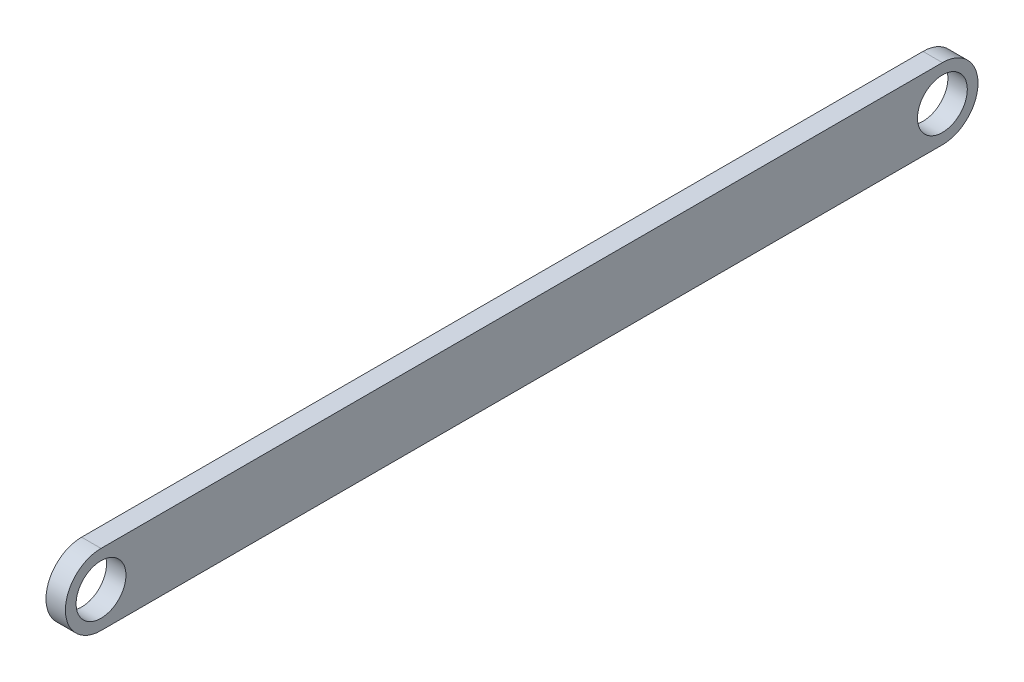
ISO-10303-21;
HEADER;
FILE_DESCRIPTION(('STEP AP214'),'2;1');
FILE_NAME('part.step','',(''),(''),'','','');
FILE_SCHEMA(('AUTOMOTIVE_DESIGN { 1 0 10303 214 1 1 1 1 }'));
ENDSEC;
DATA;
#1=APPLICATION_CONTEXT('core data for automotive mechanical design processes');
#2=APPLICATION_PROTOCOL_DEFINITION('international standard','automotive_design',2000,#1);
#3=PRODUCT_CONTEXT('',#1,'mechanical');
#4=PRODUCT('Part','Part','',(#3));
#5=PRODUCT_RELATED_PRODUCT_CATEGORY('part','',(#4));
#6=PRODUCT_DEFINITION_FORMATION('','',#4);
#7=PRODUCT_DEFINITION_CONTEXT('part definition',#1,'design');
#8=PRODUCT_DEFINITION('design','',#6,#7);
#9=PRODUCT_DEFINITION_SHAPE('','',#8);
#10=(LENGTH_UNIT() NAMED_UNIT(*) SI_UNIT(.MILLI.,.METRE.));
#11=(NAMED_UNIT(*) PLANE_ANGLE_UNIT() SI_UNIT($,.RADIAN.));
#12=(NAMED_UNIT(*) SI_UNIT($,.STERADIAN.) SOLID_ANGLE_UNIT());
#13=UNCERTAINTY_MEASURE_WITH_UNIT(LENGTH_MEASURE(1.E-05),#10,'distance_accuracy_value','');
#14=(GEOMETRIC_REPRESENTATION_CONTEXT(3) GLOBAL_UNCERTAINTY_ASSIGNED_CONTEXT((#13)) GLOBAL_UNIT_ASSIGNED_CONTEXT((#10,
#11,#12)) REPRESENTATION_CONTEXT('',''));
#15=CARTESIAN_POINT('',(0.,0.,0.));
#16=DIRECTION('',(0.,0.,1.));
#17=DIRECTION('',(1.,0.,0.));
#18=AXIS2_PLACEMENT_3D('',#15,#16,#17);
#19=CARTESIAN_POINT('',(3.,0.,0.));
#20=DIRECTION('',(1.,0.,0.));
#21=DIRECTION('',(0.,0.,-1.));
#22=AXIS2_PLACEMENT_3D('',#19,#20,#21);
#23=PLANE('',#22);
#24=CARTESIAN_POINT('',(3.,-2.22284168148864,89.1719550698585));
#25=DIRECTION('',(1.,0.,0.));
#26=DIRECTION('',(0.,0.,-1.));
#27=AXIS2_PLACEMENT_3D('',#24,#25,#26);
#28=CIRCLE('',#27,3.85);
#29=CARTESIAN_POINT('',(3.,-2.22284168148864,85.3219550698585));
#30=VERTEX_POINT('',#29);
#31=EDGE_CURVE('E103',#30,#30,#28,.T.);
#32=ORIENTED_EDGE('',*,*,#31,.F.);
#33=EDGE_LOOP('',(#32));
#34=FACE_BOUND('',#33,.T.);
#35=CARTESIAN_POINT('',(3.,-2.22284168148864,-40.828044930142));
#36=DIRECTION('',(1.,0.,0.));
#37=DIRECTION('',(0.,0.,-1.));
#38=AXIS2_PLACEMENT_3D('',#35,#36,#37);
#39=CIRCLE('',#38,5.5);
#40=CARTESIAN_POINT('',(3.,-7.72284168148864,-40.828044930142));
#41=VERTEX_POINT('',#40);
#42=CARTESIAN_POINT('',(3.,3.27715831851136,-40.828044930142));
#43=VERTEX_POINT('',#42);
#44=EDGE_CURVE('E78',#41,#43,#39,.T.);
#45=ORIENTED_EDGE('',*,*,#44,.T.);
#46=DIRECTION('',(0.,0.,-1.));
#47=VECTOR('',#46,1.);
#48=CARTESIAN_POINT('',(3.,3.27715831851136,0.));
#49=LINE('',#48,#47);
#50=CARTESIAN_POINT('',(3.,3.27715831851136,89.1719550698585));
#51=VERTEX_POINT('',#50);
#52=EDGE_CURVE('E86',#51,#43,#49,.T.);
#53=ORIENTED_EDGE('',*,*,#52,.F.);
#54=CARTESIAN_POINT('',(3.,-2.22284168148864,89.1719550698585));
#55=DIRECTION('',(1.,0.,0.));
#56=DIRECTION('',(0.,0.,-1.));
#57=AXIS2_PLACEMENT_3D('',#54,#55,#56);
#58=CIRCLE('',#57,5.5);
#59=CARTESIAN_POINT('',(3.,-7.72284168148864,89.1719550698585));
#60=VERTEX_POINT('',#59);
#61=EDGE_CURVE('E90',#51,#60,#58,.T.);
#62=ORIENTED_EDGE('',*,*,#61,.T.);
#63=DIRECTION('',(0.,0.,-1.));
#64=VECTOR('',#63,1.);
#65=CARTESIAN_POINT('',(3.,-7.72284168148864,0.));
#66=LINE('',#65,#64);
#67=EDGE_CURVE('E52',#60,#41,#66,.T.);
#68=ORIENTED_EDGE('',*,*,#67,.T.);
#69=EDGE_LOOP('',(#45,#53,#62,#68));
#70=FACE_BOUND('',#69,.T.);
#71=CARTESIAN_POINT('',(3.,-2.22284168148864,-40.828044930142));
#72=DIRECTION('',(1.,0.,0.));
#73=DIRECTION('',(0.,0.,-1.));
#74=AXIS2_PLACEMENT_3D('',#71,#72,#73);
#75=CIRCLE('',#74,3.85);
#76=CARTESIAN_POINT('',(3.,-2.22284168148864,-44.678044930142));
#77=VERTEX_POINT('',#76);
#78=EDGE_CURVE('E204',#77,#77,#75,.T.);
#79=ORIENTED_EDGE('',*,*,#78,.F.);
#80=EDGE_LOOP('',(#79));
#81=FACE_BOUND('',#80,.T.);
#82=ADVANCED_FACE('F35',(#34,#70,#81),#23,.T.);
#83=CARTESIAN_POINT('',(0.,0.,0.));
#84=DIRECTION('',(1.,0.,0.));
#85=DIRECTION('',(0.,0.,-1.));
#86=AXIS2_PLACEMENT_3D('',#83,#84,#85);
#87=PLANE('',#86);
#88=CARTESIAN_POINT('',(0.,-2.22284168148864,89.1719550698585));
#89=DIRECTION('',(1.,0.,0.));
#90=DIRECTION('',(0.,0.,-1.));
#91=AXIS2_PLACEMENT_3D('',#88,#89,#90);
#92=CIRCLE('',#91,3.85);
#93=CARTESIAN_POINT('',(0.,-2.22284168148864,85.3219550698585));
#94=VERTEX_POINT('',#93);
#95=EDGE_CURVE('E209',#94,#94,#92,.T.);
#96=ORIENTED_EDGE('',*,*,#95,.T.);
#97=EDGE_LOOP('',(#96));
#98=FACE_BOUND('',#97,.T.);
#99=CARTESIAN_POINT('',(0.,-2.22284168148864,-40.828044930142));
#100=DIRECTION('',(1.,0.,0.));
#101=DIRECTION('',(0.,0.,-1.));
#102=AXIS2_PLACEMENT_3D('',#99,#100,#101);
#103=CIRCLE('',#102,5.5);
#104=CARTESIAN_POINT('',(0.,-7.72284168148864,-40.828044930142));
#105=VERTEX_POINT('',#104);
#106=CARTESIAN_POINT('',(0.,3.27715831851136,-40.828044930142));
#107=VERTEX_POINT('',#106);
#108=EDGE_CURVE('E100',#105,#107,#103,.T.);
#109=ORIENTED_EDGE('',*,*,#108,.F.);
#110=DIRECTION('',(0.,0.,-1.));
#111=VECTOR('',#110,1.);
#112=CARTESIAN_POINT('',(0.,-7.72284168148864,0.));
#113=LINE('',#112,#111);
#114=CARTESIAN_POINT('',(0.,-7.72284168148864,89.1719550698585));
#115=VERTEX_POINT('',#114);
#116=EDGE_CURVE('E73',#115,#105,#113,.T.);
#117=ORIENTED_EDGE('',*,*,#116,.F.);
#118=CARTESIAN_POINT('',(0.,-2.22284168148864,89.1719550698585));
#119=DIRECTION('',(1.,0.,0.));
#120=DIRECTION('',(0.,0.,-1.));
#121=AXIS2_PLACEMENT_3D('',#118,#119,#120);
#122=CIRCLE('',#121,5.5);
#123=CARTESIAN_POINT('',(0.,3.27715831851136,89.1719550698585));
#124=VERTEX_POINT('',#123);
#125=EDGE_CURVE('E67',#124,#115,#122,.T.);
#126=ORIENTED_EDGE('',*,*,#125,.F.);
#127=DIRECTION('',(0.,0.,-1.));
#128=VECTOR('',#127,1.);
#129=CARTESIAN_POINT('',(0.,3.27715831851136,0.));
#130=LINE('',#129,#128);
#131=EDGE_CURVE('E88',#124,#107,#130,.T.);
#132=ORIENTED_EDGE('',*,*,#131,.T.);
#133=EDGE_LOOP('',(#109,#117,#126,#132));
#134=FACE_BOUND('',#133,.T.);
#135=CARTESIAN_POINT('',(0.,-2.22284168148864,-40.828044930142));
#136=DIRECTION('',(1.,0.,0.));
#137=DIRECTION('',(0.,0.,-1.));
#138=AXIS2_PLACEMENT_3D('',#135,#136,#137);
#139=CIRCLE('',#138,3.85);
#140=CARTESIAN_POINT('',(0.,-2.22284168148864,-44.678044930142));
#141=VERTEX_POINT('',#140);
#142=EDGE_CURVE('E207',#141,#141,#139,.T.);
#143=ORIENTED_EDGE('',*,*,#142,.T.);
#144=EDGE_LOOP('',(#143));
#145=FACE_BOUND('',#144,.T.);
#146=ADVANCED_FACE('F111',(#98,#134,#145),#87,.F.);
#147=CARTESIAN_POINT('',(3.,-2.22284168148864,-40.828044930142));
#148=DIRECTION('',(-1.,0.,0.));
#149=DIRECTION('',(0.,0.,1.));
#150=AXIS2_PLACEMENT_3D('',#147,#148,#149);
#151=CYLINDRICAL_SURFACE('',#150,5.5);
#152=ORIENTED_EDGE('',*,*,#108,.T.);
#153=DIRECTION('',(-1.,0.,0.));
#154=VECTOR('',#153,1.);
#155=CARTESIAN_POINT('',(3.,3.27715831851136,-40.828044930142));
#156=LINE('',#155,#154);
#157=EDGE_CURVE('E11',#43,#107,#156,.T.);
#158=ORIENTED_EDGE('',*,*,#157,.F.);
#159=ORIENTED_EDGE('',*,*,#44,.F.);
#160=DIRECTION('',(-1.,0.,0.));
#161=VECTOR('',#160,1.);
#162=CARTESIAN_POINT('',(3.,-7.72284168148864,-40.828044930142));
#163=LINE('',#162,#161);
#164=EDGE_CURVE('E99',#41,#105,#163,.T.);
#165=ORIENTED_EDGE('',*,*,#164,.T.);
#166=EDGE_LOOP('',(#152,#158,#159,#165));
#167=FACE_BOUND('',#166,.T.);
#168=ADVANCED_FACE('F37',(#167),#151,.T.);
#169=CARTESIAN_POINT('',(3.,3.27715831851136,0.));
#170=DIRECTION('',(0.,1.,0.));
#171=DIRECTION('',(0.,0.,1.));
#172=AXIS2_PLACEMENT_3D('',#169,#170,#171);
#173=PLANE('',#172);
#174=ORIENTED_EDGE('',*,*,#131,.F.);
#175=DIRECTION('',(-1.,0.,0.));
#176=VECTOR('',#175,1.);
#177=CARTESIAN_POINT('',(3.,3.27715831851136,89.1719550698585));
#178=LINE('',#177,#176);
#179=EDGE_CURVE('E44',#51,#124,#178,.T.);
#180=ORIENTED_EDGE('',*,*,#179,.F.);
#181=ORIENTED_EDGE('',*,*,#52,.T.);
#182=ORIENTED_EDGE('',*,*,#157,.T.);
#183=EDGE_LOOP('',(#174,#180,#181,#182));
#184=FACE_BOUND('',#183,.T.);
#185=ADVANCED_FACE('F85',(#184),#173,.T.);
#186=CARTESIAN_POINT('',(3.,-2.22284168148864,89.1719550698585));
#187=DIRECTION('',(-1.,0.,0.));
#188=DIRECTION('',(0.,0.,1.));
#189=AXIS2_PLACEMENT_3D('',#186,#187,#188);
#190=CYLINDRICAL_SURFACE('',#189,5.5);
#191=ORIENTED_EDGE('',*,*,#125,.T.);
#192=DIRECTION('',(-1.,0.,0.));
#193=VECTOR('',#192,1.);
#194=CARTESIAN_POINT('',(3.,-7.72284168148864,89.1719550698585));
#195=LINE('',#194,#193);
#196=EDGE_CURVE('E89',#60,#115,#195,.T.);
#197=ORIENTED_EDGE('',*,*,#196,.F.);
#198=ORIENTED_EDGE('',*,*,#61,.F.);
#199=ORIENTED_EDGE('',*,*,#179,.T.);
#200=EDGE_LOOP('',(#191,#197,#198,#199));
#201=FACE_BOUND('',#200,.T.);
#202=ADVANCED_FACE('F91',(#201),#190,.T.);
#203=CARTESIAN_POINT('',(3.,-7.72284168148864,0.));
#204=DIRECTION('',(0.,1.,0.));
#205=DIRECTION('',(0.,0.,1.));
#206=AXIS2_PLACEMENT_3D('',#203,#204,#205);
#207=PLANE('',#206);
#208=ORIENTED_EDGE('',*,*,#116,.T.);
#209=ORIENTED_EDGE('',*,*,#164,.F.);
#210=ORIENTED_EDGE('',*,*,#67,.F.);
#211=ORIENTED_EDGE('',*,*,#196,.T.);
#212=EDGE_LOOP('',(#208,#209,#210,#211));
#213=FACE_BOUND('',#212,.T.);
#214=ADVANCED_FACE('F108',(#213),#207,.F.);
#215=CARTESIAN_POINT('',(3.,-2.22284168148864,89.1719550698585));
#216=DIRECTION('',(-1.,0.,0.));
#217=DIRECTION('',(0.,0.,1.));
#218=AXIS2_PLACEMENT_3D('',#215,#216,#217);
#219=CYLINDRICAL_SURFACE('',#218,3.85);
#220=ORIENTED_EDGE('',*,*,#31,.T.);
#221=EDGE_LOOP('',(#220));
#222=FACE_BOUND('',#221,.T.);
#223=ORIENTED_EDGE('',*,*,#95,.F.);
#224=EDGE_LOOP('',(#223));
#225=FACE_BOUND('',#224,.T.);
#226=ADVANCED_FACE('F128',(#222,#225),#219,.F.);
#227=CARTESIAN_POINT('',(3.,-2.22284168148864,-40.828044930142));
#228=DIRECTION('',(-1.,0.,0.));
#229=DIRECTION('',(0.,0.,1.));
#230=AXIS2_PLACEMENT_3D('',#227,#228,#229);
#231=CYLINDRICAL_SURFACE('',#230,3.85);
#232=ORIENTED_EDGE('',*,*,#78,.T.);
#233=EDGE_LOOP('',(#232));
#234=FACE_BOUND('',#233,.T.);
#235=ORIENTED_EDGE('',*,*,#142,.F.);
#236=EDGE_LOOP('',(#235));
#237=FACE_BOUND('',#236,.T.);
#238=ADVANCED_FACE('F148',(#234,#237),#231,.F.);
#239=CLOSED_SHELL('',(#82,#146,#168,#185,#202,#214,#226,#238));
#240=MANIFOLD_SOLID_BREP('B2',#239);
#241=ADVANCED_BREP_SHAPE_REPRESENTATION('',(#18,#240),#14);
#242=SHAPE_DEFINITION_REPRESENTATION(#9,#241);
ENDSEC;
END-ISO-10303-21;
